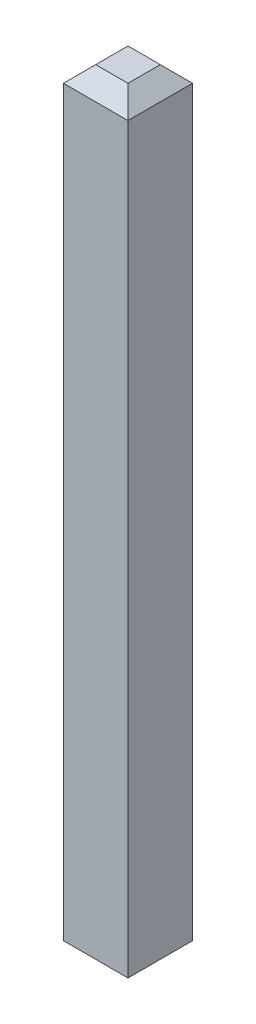
ISO-10303-21;
HEADER;
FILE_DESCRIPTION(('STEP AP214'),'2;1');
FILE_NAME('part.step','',(''),(''),'','','');
FILE_SCHEMA(('AUTOMOTIVE_DESIGN { 1 0 10303 214 1 1 1 1 }'));
ENDSEC;
DATA;
#1=APPLICATION_CONTEXT('core data for automotive mechanical design processes');
#2=APPLICATION_PROTOCOL_DEFINITION('international standard','automotive_design',2000,#1);
#3=PRODUCT_CONTEXT('',#1,'mechanical');
#4=PRODUCT('Part','Part','',(#3));
#5=PRODUCT_RELATED_PRODUCT_CATEGORY('part','',(#4));
#6=PRODUCT_DEFINITION_FORMATION('','',#4);
#7=PRODUCT_DEFINITION_CONTEXT('part definition',#1,'design');
#8=PRODUCT_DEFINITION('design','',#6,#7);
#9=PRODUCT_DEFINITION_SHAPE('','',#8);
#10=(LENGTH_UNIT() NAMED_UNIT(*) SI_UNIT(.MILLI.,.METRE.));
#11=(NAMED_UNIT(*) PLANE_ANGLE_UNIT() SI_UNIT($,.RADIAN.));
#12=(NAMED_UNIT(*) SI_UNIT($,.STERADIAN.) SOLID_ANGLE_UNIT());
#13=UNCERTAINTY_MEASURE_WITH_UNIT(LENGTH_MEASURE(1.E-05),#10,'distance_accuracy_value','');
#14=(GEOMETRIC_REPRESENTATION_CONTEXT(3) GLOBAL_UNCERTAINTY_ASSIGNED_CONTEXT((#13)) GLOBAL_UNIT_ASSIGNED_CONTEXT((#10,
#11,#12)) REPRESENTATION_CONTEXT('',''));
#15=CARTESIAN_POINT('',(0.,0.,0.));
#16=DIRECTION('',(0.,0.,1.));
#17=DIRECTION('',(1.,0.,0.));
#18=AXIS2_PLACEMENT_3D('',#15,#16,#17);
#19=CARTESIAN_POINT('',(-0.375,0.125,-0.25));
#20=DIRECTION('',(-0.707106781186548,-0.707106781186548,0.));
#21=DIRECTION('',(0.707106781186548,-0.707106781186548,0.));
#22=AXIS2_PLACEMENT_3D('',#19,#20,#21);
#23=PLANE('',#22);
#24=DIRECTION('',(0.,0.,1.));
#25=VECTOR('',#24,1.);
#26=CARTESIAN_POINT('',(-0.5,0.25,-0.5));
#27=LINE('',#26,#25);
#28=CARTESIAN_POINT('',(-0.5,0.25,-0.5));
#29=VERTEX_POINT('',#28);
#30=CARTESIAN_POINT('',(-0.5,0.25,0.5));
#31=VERTEX_POINT('',#30);
#32=EDGE_CURVE('E96',#29,#31,#27,.T.);
#33=ORIENTED_EDGE('',*,*,#32,.F.);
#34=DIRECTION('',(-0.577350269189626,0.577350269189626,-0.577350269189626));
#35=VECTOR('',#34,1.);
#36=CARTESIAN_POINT('',(-0.25,0.,-0.25));
#37=LINE('',#36,#35);
#38=CARTESIAN_POINT('',(-0.25,0.,-0.25));
#39=VERTEX_POINT('',#38);
#40=EDGE_CURVE('E94',#39,#29,#37,.T.);
#41=ORIENTED_EDGE('',*,*,#40,.F.);
#42=DIRECTION('',(0.,0.,1.));
#43=VECTOR('',#42,1.);
#44=CARTESIAN_POINT('',(-0.25,0.,0.));
#45=LINE('',#44,#43);
#46=CARTESIAN_POINT('',(-0.25,0.,0.25));
#47=VERTEX_POINT('',#46);
#48=EDGE_CURVE('E20',#39,#47,#45,.T.);
#49=ORIENTED_EDGE('',*,*,#48,.T.);
#50=DIRECTION('',(0.577350269189626,-0.577350269189626,-0.577350269189626));
#51=VECTOR('',#50,1.);
#52=CARTESIAN_POINT('',(-0.5,0.25,0.5));
#53=LINE('',#52,#51);
#54=EDGE_CURVE('E113',#31,#47,#53,.T.);
#55=ORIENTED_EDGE('',*,*,#54,.F.);
#56=EDGE_LOOP('',(#33,#41,#49,#55));
#57=FACE_BOUND('',#56,.T.);
#58=ADVANCED_FACE('F17',(#57),#23,.T.);
#59=CARTESIAN_POINT('',(-0.375,11.875,-0.25));
#60=DIRECTION('',(-0.707106781186546,0.707106781186549,0.));
#61=DIRECTION('',(-0.707106781186549,-0.707106781186546,0.));
#62=AXIS2_PLACEMENT_3D('',#59,#60,#61);
#63=PLANE('',#62);
#64=DIRECTION('',(0.,0.,1.));
#65=VECTOR('',#64,1.);
#66=CARTESIAN_POINT('',(-0.5,11.75,-0.5));
#67=LINE('',#66,#65);
#68=CARTESIAN_POINT('',(-0.5,11.75,0.5));
#69=VERTEX_POINT('',#68);
#70=CARTESIAN_POINT('',(-0.5,11.75,-0.5));
#71=VERTEX_POINT('',#70);
#72=EDGE_CURVE('E121',#69,#71,#67,.F.);
#73=ORIENTED_EDGE('',*,*,#72,.F.);
#74=DIRECTION('',(-0.577350269189625,-0.577350269189625,0.577350269189627));
#75=VECTOR('',#74,1.);
#76=CARTESIAN_POINT('',(-0.25,12.,0.25));
#77=LINE('',#76,#75);
#78=CARTESIAN_POINT('',(-0.25,12.,0.25));
#79=VERTEX_POINT('',#78);
#80=EDGE_CURVE('E118',#79,#69,#77,.T.);
#81=ORIENTED_EDGE('',*,*,#80,.F.);
#82=DIRECTION('',(0.,0.,1.));
#83=VECTOR('',#82,1.);
#84=CARTESIAN_POINT('',(-0.25,12.,0.));
#85=LINE('',#84,#83);
#86=CARTESIAN_POINT('',(-0.25,12.,-0.25));
#87=VERTEX_POINT('',#86);
#88=EDGE_CURVE('E79',#87,#79,#85,.T.);
#89=ORIENTED_EDGE('',*,*,#88,.F.);
#90=DIRECTION('',(0.577350269189625,0.577350269189625,0.577350269189627));
#91=VECTOR('',#90,1.);
#92=CARTESIAN_POINT('',(-0.5,11.75,-0.5));
#93=LINE('',#92,#91);
#94=EDGE_CURVE('E109',#71,#87,#93,.T.);
#95=ORIENTED_EDGE('',*,*,#94,.F.);
#96=EDGE_LOOP('',(#73,#81,#89,#95));
#97=FACE_BOUND('',#96,.T.);
#98=ADVANCED_FACE('F283',(#97),#63,.T.);
#99=CARTESIAN_POINT('',(0.,0.,0.));
#100=DIRECTION('',(0.,1.,0.));
#101=DIRECTION('',(0.,0.,1.));
#102=AXIS2_PLACEMENT_3D('',#99,#100,#101);
#103=PLANE('',#102);
#104=DIRECTION('',(0.,0.,1.));
#105=VECTOR('',#104,1.);
#106=CARTESIAN_POINT('',(0.25,0.,0.25));
#107=LINE('',#106,#105);
#108=CARTESIAN_POINT('',(0.25,0.,0.25));
#109=VERTEX_POINT('',#108);
#110=CARTESIAN_POINT('',(0.25,0.,-0.25));
#111=VERTEX_POINT('',#110);
#112=EDGE_CURVE('E124',#109,#111,#107,.F.);
#113=ORIENTED_EDGE('',*,*,#112,.F.);
#114=DIRECTION('',(1.,0.,0.));
#115=VECTOR('',#114,1.);
#116=CARTESIAN_POINT('',(-0.25,0.,0.25));
#117=LINE('',#116,#115);
#118=EDGE_CURVE('E90',#47,#109,#117,.T.);
#119=ORIENTED_EDGE('',*,*,#118,.F.);
#120=ORIENTED_EDGE('',*,*,#48,.F.);
#121=DIRECTION('',(1.,0.,0.));
#122=VECTOR('',#121,1.);
#123=CARTESIAN_POINT('',(0.25,0.,-0.25));
#124=LINE('',#123,#122);
#125=EDGE_CURVE('E87',#111,#39,#124,.F.);
#126=ORIENTED_EDGE('',*,*,#125,.F.);
#127=EDGE_LOOP('',(#113,#119,#120,#126));
#128=FACE_BOUND('',#127,.T.);
#129=ADVANCED_FACE('F85',(#128),#103,.F.);
#130=CARTESIAN_POINT('',(0.25,0.125,-0.375));
#131=DIRECTION('',(0.,-0.707106781186548,-0.707106781186548));
#132=DIRECTION('',(0.,0.707106781186548,-0.707106781186548));
#133=AXIS2_PLACEMENT_3D('',#130,#131,#132);
#134=PLANE('',#133);
#135=ORIENTED_EDGE('',*,*,#125,.T.);
#136=ORIENTED_EDGE('',*,*,#40,.T.);
#137=DIRECTION('',(-1.,0.,0.));
#138=VECTOR('',#137,1.);
#139=CARTESIAN_POINT('',(0.5,0.25,-0.5));
#140=LINE('',#139,#138);
#141=CARTESIAN_POINT('',(0.5,0.25,-0.5));
#142=VERTEX_POINT('',#141);
#143=EDGE_CURVE('E130',#142,#29,#140,.T.);
#144=ORIENTED_EDGE('',*,*,#143,.F.);
#145=DIRECTION('',(0.577350269189626,0.577350269189626,-0.577350269189626));
#146=VECTOR('',#145,1.);
#147=CARTESIAN_POINT('',(0.25,0.,-0.25));
#148=LINE('',#147,#146);
#149=EDGE_CURVE('E102',#111,#142,#148,.T.);
#150=ORIENTED_EDGE('',*,*,#149,.F.);
#151=EDGE_LOOP('',(#135,#136,#144,#150));
#152=FACE_BOUND('',#151,.T.);
#153=ADVANCED_FACE('F100',(#152),#134,.T.);
#154=CARTESIAN_POINT('',(0.,12.,0.));
#155=DIRECTION('',(0.,1.,0.));
#156=DIRECTION('',(0.,0.,1.));
#157=AXIS2_PLACEMENT_3D('',#154,#155,#156);
#158=PLANE('',#157);
#159=DIRECTION('',(0.,0.,1.));
#160=VECTOR('',#159,1.);
#161=CARTESIAN_POINT('',(0.25,12.,0.25));
#162=LINE('',#161,#160);
#163=CARTESIAN_POINT('',(0.25,12.,-0.25));
#164=VERTEX_POINT('',#163);
#165=CARTESIAN_POINT('',(0.25,12.,0.25));
#166=VERTEX_POINT('',#165);
#167=EDGE_CURVE('E139',#164,#166,#162,.T.);
#168=ORIENTED_EDGE('',*,*,#167,.F.);
#169=DIRECTION('',(1.,0.,0.));
#170=VECTOR('',#169,1.);
#171=CARTESIAN_POINT('',(0.25,12.,-0.25));
#172=LINE('',#171,#170);
#173=EDGE_CURVE('E106',#87,#164,#172,.T.);
#174=ORIENTED_EDGE('',*,*,#173,.F.);
#175=ORIENTED_EDGE('',*,*,#88,.T.);
#176=DIRECTION('',(1.,0.,0.));
#177=VECTOR('',#176,1.);
#178=CARTESIAN_POINT('',(-0.25,12.,0.25));
#179=LINE('',#178,#177);
#180=EDGE_CURVE('E115',#166,#79,#179,.F.);
#181=ORIENTED_EDGE('',*,*,#180,.F.);
#182=EDGE_LOOP('',(#168,#174,#175,#181));
#183=FACE_BOUND('',#182,.T.);
#184=ADVANCED_FACE('F259',(#183),#158,.T.);
#185=CARTESIAN_POINT('',(0.25,11.875,-0.375));
#186=DIRECTION('',(0.,0.707106781186549,-0.707106781186546));
#187=DIRECTION('',(0.,0.707106781186546,0.707106781186549));
#188=AXIS2_PLACEMENT_3D('',#185,#186,#187);
#189=PLANE('',#188);
#190=DIRECTION('',(-1.,0.,0.));
#191=VECTOR('',#190,1.);
#192=CARTESIAN_POINT('',(0.5,11.75,-0.5));
#193=LINE('',#192,#191);
#194=CARTESIAN_POINT('',(0.5,11.75,-0.5));
#195=VERTEX_POINT('',#194);
#196=EDGE_CURVE('E136',#71,#195,#193,.F.);
#197=ORIENTED_EDGE('',*,*,#196,.F.);
#198=ORIENTED_EDGE('',*,*,#94,.T.);
#199=ORIENTED_EDGE('',*,*,#173,.T.);
#200=DIRECTION('',(-0.577350269189627,0.577350269189625,0.577350269189625));
#201=VECTOR('',#200,1.);
#202=CARTESIAN_POINT('',(0.5,11.75,-0.5));
#203=LINE('',#202,#201);
#204=EDGE_CURVE('E144',#195,#164,#203,.T.);
#205=ORIENTED_EDGE('',*,*,#204,.F.);
#206=EDGE_LOOP('',(#197,#198,#199,#205));
#207=FACE_BOUND('',#206,.T.);
#208=ADVANCED_FACE('F251',(#207),#189,.T.);
#209=CARTESIAN_POINT('',(-0.25,0.125,0.375));
#210=DIRECTION('',(0.,-0.707106781186548,0.707106781186548));
#211=DIRECTION('',(0.,-0.707106781186548,-0.707106781186548));
#212=AXIS2_PLACEMENT_3D('',#209,#210,#211);
#213=PLANE('',#212);
#214=DIRECTION('',(1.,0.,0.));
#215=VECTOR('',#214,1.);
#216=CARTESIAN_POINT('',(-0.5,0.25,0.5));
#217=LINE('',#216,#215);
#218=CARTESIAN_POINT('',(0.5,0.25,0.5));
#219=VERTEX_POINT('',#218);
#220=EDGE_CURVE('E147',#31,#219,#217,.T.);
#221=ORIENTED_EDGE('',*,*,#220,.F.);
#222=ORIENTED_EDGE('',*,*,#54,.T.);
#223=ORIENTED_EDGE('',*,*,#118,.T.);
#224=DIRECTION('',(-0.577350269189626,-0.577350269189626,-0.577350269189626));
#225=VECTOR('',#224,1.);
#226=CARTESIAN_POINT('',(0.5,0.25,0.5));
#227=LINE('',#226,#225);
#228=EDGE_CURVE('E127',#219,#109,#227,.T.);
#229=ORIENTED_EDGE('',*,*,#228,.F.);
#230=EDGE_LOOP('',(#221,#222,#223,#229));
#231=FACE_BOUND('',#230,.T.);
#232=ADVANCED_FACE('F173',(#231),#213,.T.);
#233=CARTESIAN_POINT('',(-0.25,11.875,0.375));
#234=DIRECTION('',(0.,0.707106781186549,0.707106781186546));
#235=DIRECTION('',(0.,-0.707106781186546,0.707106781186549));
#236=AXIS2_PLACEMENT_3D('',#233,#234,#235);
#237=PLANE('',#236);
#238=ORIENTED_EDGE('',*,*,#180,.T.);
#239=ORIENTED_EDGE('',*,*,#80,.T.);
#240=DIRECTION('',(1.,0.,0.));
#241=VECTOR('',#240,1.);
#242=CARTESIAN_POINT('',(-0.5,11.75,0.5));
#243=LINE('',#242,#241);
#244=CARTESIAN_POINT('',(0.5,11.75,0.5));
#245=VERTEX_POINT('',#244);
#246=EDGE_CURVE('E35',#245,#69,#243,.F.);
#247=ORIENTED_EDGE('',*,*,#246,.F.);
#248=DIRECTION('',(0.577350269189627,-0.577350269189625,0.577350269189625));
#249=VECTOR('',#248,1.);
#250=CARTESIAN_POINT('',(0.25,12.,0.25));
#251=LINE('',#250,#249);
#252=EDGE_CURVE('E142',#166,#245,#251,.T.);
#253=ORIENTED_EDGE('',*,*,#252,.F.);
#254=EDGE_LOOP('',(#238,#239,#247,#253));
#255=FACE_BOUND('',#254,.T.);
#256=ADVANCED_FACE('F190',(#255),#237,.T.);
#257=CARTESIAN_POINT('',(-0.5,0.,-0.5));
#258=DIRECTION('',(-1.,0.,0.));
#259=DIRECTION('',(0.,0.,1.));
#260=AXIS2_PLACEMENT_3D('',#257,#258,#259);
#261=PLANE('',#260);
#262=ORIENTED_EDGE('',*,*,#72,.T.);
#263=DIRECTION('',(0.,1.,0.));
#264=VECTOR('',#263,1.);
#265=CARTESIAN_POINT('',(-0.5,0.,-0.5));
#266=LINE('',#265,#264);
#267=EDGE_CURVE('E133',#29,#71,#266,.T.);
#268=ORIENTED_EDGE('',*,*,#267,.F.);
#269=ORIENTED_EDGE('',*,*,#32,.T.);
#270=DIRECTION('',(0.,1.,0.));
#271=VECTOR('',#270,1.);
#272=CARTESIAN_POINT('',(-0.5,0.,0.5));
#273=LINE('',#272,#271);
#274=EDGE_CURVE('E151',#69,#31,#273,.F.);
#275=ORIENTED_EDGE('',*,*,#274,.F.);
#276=EDGE_LOOP('',(#262,#268,#269,#275));
#277=FACE_BOUND('',#276,.T.);
#278=ADVANCED_FACE('F176',(#277),#261,.T.);
#279=CARTESIAN_POINT('',(0.375,0.125,0.25));
#280=DIRECTION('',(0.707106781186548,-0.707106781186548,0.));
#281=DIRECTION('',(0.707106781186548,0.707106781186548,0.));
#282=AXIS2_PLACEMENT_3D('',#279,#280,#281);
#283=PLANE('',#282);
#284=DIRECTION('',(0.,0.,-1.));
#285=VECTOR('',#284,1.);
#286=CARTESIAN_POINT('',(0.5,0.25,0.5));
#287=LINE('',#286,#285);
#288=EDGE_CURVE('E154',#219,#142,#287,.T.);
#289=ORIENTED_EDGE('',*,*,#288,.F.);
#290=ORIENTED_EDGE('',*,*,#228,.T.);
#291=ORIENTED_EDGE('',*,*,#112,.T.);
#292=ORIENTED_EDGE('',*,*,#149,.T.);
#293=EDGE_LOOP('',(#289,#290,#291,#292));
#294=FACE_BOUND('',#293,.T.);
#295=ADVANCED_FACE('F181',(#294),#283,.T.);
#296=CARTESIAN_POINT('',(0.5,0.,-0.5));
#297=DIRECTION('',(0.,0.,-1.));
#298=DIRECTION('',(-1.,0.,0.));
#299=AXIS2_PLACEMENT_3D('',#296,#297,#298);
#300=PLANE('',#299);
#301=ORIENTED_EDGE('',*,*,#196,.T.);
#302=DIRECTION('',(0.,1.,0.));
#303=VECTOR('',#302,1.);
#304=CARTESIAN_POINT('',(0.5,0.,-0.5));
#305=LINE('',#304,#303);
#306=EDGE_CURVE('E157',#142,#195,#305,.T.);
#307=ORIENTED_EDGE('',*,*,#306,.F.);
#308=ORIENTED_EDGE('',*,*,#143,.T.);
#309=ORIENTED_EDGE('',*,*,#267,.T.);
#310=EDGE_LOOP('',(#301,#307,#308,#309));
#311=FACE_BOUND('',#310,.T.);
#312=ADVANCED_FACE('F179',(#311),#300,.T.);
#313=CARTESIAN_POINT('',(0.375,11.875,0.25));
#314=DIRECTION('',(0.707106781186546,0.707106781186549,0.));
#315=DIRECTION('',(-0.707106781186549,0.707106781186546,0.));
#316=AXIS2_PLACEMENT_3D('',#313,#314,#315);
#317=PLANE('',#316);
#318=DIRECTION('',(0.,0.,-1.));
#319=VECTOR('',#318,1.);
#320=CARTESIAN_POINT('',(0.5,11.75,0.5));
#321=LINE('',#320,#319);
#322=EDGE_CURVE('E26',#195,#245,#321,.F.);
#323=ORIENTED_EDGE('',*,*,#322,.F.);
#324=ORIENTED_EDGE('',*,*,#204,.T.);
#325=ORIENTED_EDGE('',*,*,#167,.T.);
#326=ORIENTED_EDGE('',*,*,#252,.T.);
#327=EDGE_LOOP('',(#323,#324,#325,#326));
#328=FACE_BOUND('',#327,.T.);
#329=ADVANCED_FACE('F167',(#328),#317,.T.);
#330=CARTESIAN_POINT('',(-0.5,0.,0.5));
#331=DIRECTION('',(0.,0.,1.));
#332=DIRECTION('',(1.,0.,0.));
#333=AXIS2_PLACEMENT_3D('',#330,#331,#332);
#334=PLANE('',#333);
#335=ORIENTED_EDGE('',*,*,#246,.T.);
#336=ORIENTED_EDGE('',*,*,#274,.T.);
#337=ORIENTED_EDGE('',*,*,#220,.T.);
#338=DIRECTION('',(0.,1.,0.));
#339=VECTOR('',#338,1.);
#340=CARTESIAN_POINT('',(0.5,0.,0.5));
#341=LINE('',#340,#339);
#342=EDGE_CURVE('E11',#245,#219,#341,.F.);
#343=ORIENTED_EDGE('',*,*,#342,.F.);
#344=EDGE_LOOP('',(#335,#336,#337,#343));
#345=FACE_BOUND('',#344,.T.);
#346=ADVANCED_FACE('F169',(#345),#334,.T.);
#347=CARTESIAN_POINT('',(0.5,0.,0.5));
#348=DIRECTION('',(1.,0.,0.));
#349=DIRECTION('',(0.,0.,-1.));
#350=AXIS2_PLACEMENT_3D('',#347,#348,#349);
#351=PLANE('',#350);
#352=ORIENTED_EDGE('',*,*,#322,.T.);
#353=ORIENTED_EDGE('',*,*,#342,.T.);
#354=ORIENTED_EDGE('',*,*,#288,.T.);
#355=ORIENTED_EDGE('',*,*,#306,.T.);
#356=EDGE_LOOP('',(#352,#353,#354,#355));
#357=FACE_BOUND('',#356,.T.);
#358=ADVANCED_FACE('F163',(#357),#351,.T.);
#359=CLOSED_SHELL('',(#58,#98,#129,#153,#184,#208,#232,#256,#278,#295,#312,#329,#346,#358));
#360=MANIFOLD_SOLID_BREP('B1',#359);
#361=ADVANCED_BREP_SHAPE_REPRESENTATION('',(#18,#360),#14);
#362=SHAPE_DEFINITION_REPRESENTATION(#9,#361);
ENDSEC;
END-ISO-10303-21;
